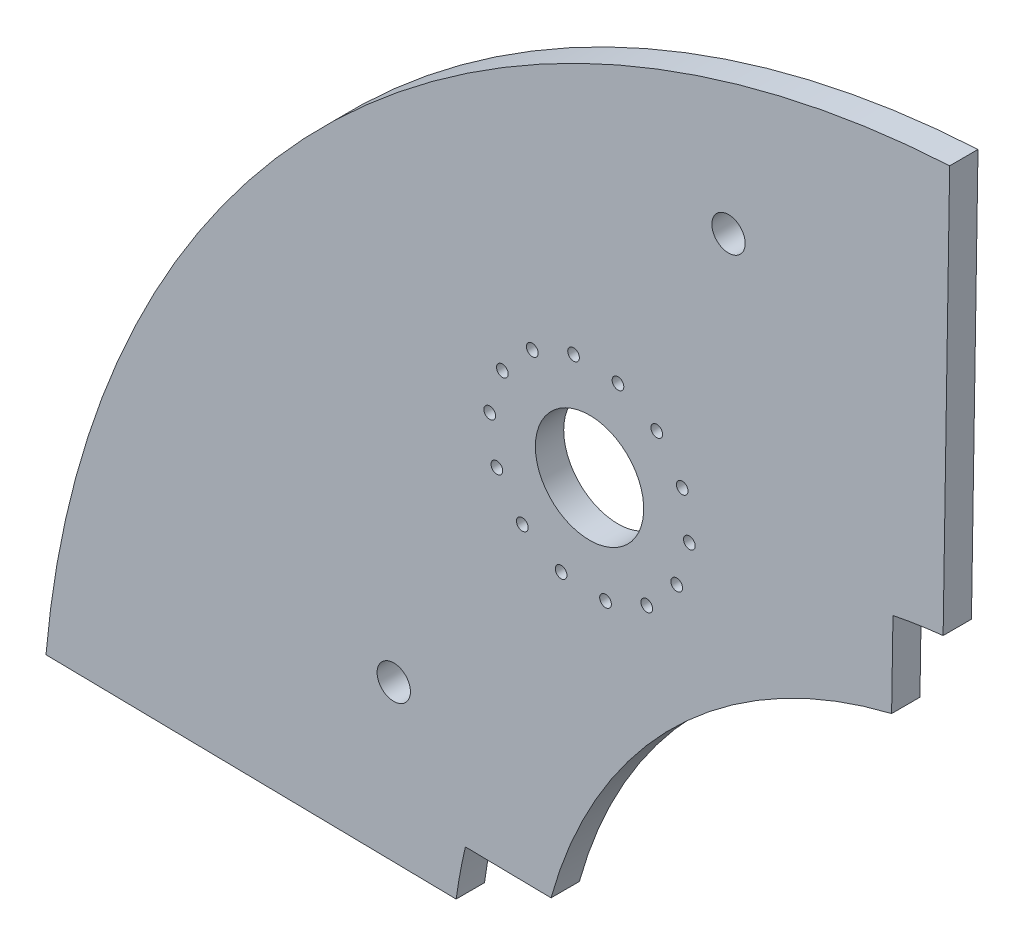
ISO-10303-21;
HEADER;
FILE_DESCRIPTION(('STEP AP214'),'2;1');
FILE_NAME('part.step','',(''),(''),'','','');
FILE_SCHEMA(('AUTOMOTIVE_DESIGN { 1 0 10303 214 1 1 1 1 }'));
ENDSEC;
DATA;
#1=APPLICATION_CONTEXT('core data for automotive mechanical design processes');
#2=APPLICATION_PROTOCOL_DEFINITION('international standard','automotive_design',2000,#1);
#3=PRODUCT_CONTEXT('',#1,'mechanical');
#4=PRODUCT('Part','Part','',(#3));
#5=PRODUCT_RELATED_PRODUCT_CATEGORY('part','',(#4));
#6=PRODUCT_DEFINITION_FORMATION('','',#4);
#7=PRODUCT_DEFINITION_CONTEXT('part definition',#1,'design');
#8=PRODUCT_DEFINITION('design','',#6,#7);
#9=PRODUCT_DEFINITION_SHAPE('','',#8);
#10=(LENGTH_UNIT() NAMED_UNIT(*) SI_UNIT(.MILLI.,.METRE.));
#11=(NAMED_UNIT(*) PLANE_ANGLE_UNIT() SI_UNIT($,.RADIAN.));
#12=(NAMED_UNIT(*) SI_UNIT($,.STERADIAN.) SOLID_ANGLE_UNIT());
#13=UNCERTAINTY_MEASURE_WITH_UNIT(LENGTH_MEASURE(1.E-05),#10,'distance_accuracy_value','');
#14=(GEOMETRIC_REPRESENTATION_CONTEXT(3) GLOBAL_UNCERTAINTY_ASSIGNED_CONTEXT((#13)) GLOBAL_UNIT_ASSIGNED_CONTEXT((#10,
#11,#12)) REPRESENTATION_CONTEXT('',''));
#15=CARTESIAN_POINT('',(0.,0.,0.));
#16=DIRECTION('',(0.,0.,1.));
#17=DIRECTION('',(1.,0.,0.));
#18=AXIS2_PLACEMENT_3D('',#15,#16,#17);
#19=CARTESIAN_POINT('',(4.07862578885082,4.75361348173175,1.7));
#20=DIRECTION('',(0.,0.,1.));
#21=DIRECTION('',(1.,0.,0.));
#22=AXIS2_PLACEMENT_3D('',#19,#20,#21);
#23=PLANE('',#22);
#24=CARTESIAN_POINT('',(-12.2707574441854,52.0050438082216,1.7));
#25=DIRECTION('',(0.,0.,1.));
#26=DIRECTION('',(1.,0.,0.));
#27=AXIS2_PLACEMENT_3D('',#24,#25,#26);
#28=CIRCLE('',#27,0.999999999997956);
#29=CARTESIAN_POINT('',(-11.2707574441874,52.0050438082216,1.7));
#30=VERTEX_POINT('',#29);
#31=EDGE_CURVE('E162',#30,#30,#28,.T.);
#32=ORIENTED_EDGE('',*,*,#31,.F.);
#33=EDGE_LOOP('',(#32));
#34=FACE_BOUND('',#33,.T.);
#35=CARTESIAN_POINT('',(-21.5660954258525,41.0912692689008,1.7));
#36=DIRECTION('',(0.,0.,1.));
#37=DIRECTION('',(-1.,0.,0.));
#38=AXIS2_PLACEMENT_3D('',#35,#36,#37);
#39=CIRCLE('',#38,0.349999999999997);
#40=CARTESIAN_POINT('',(-21.9160954258525,41.0912692689008,1.7));
#41=VERTEX_POINT('',#40);
#42=EDGE_CURVE('E179',#41,#41,#39,.T.);
#43=ORIENTED_EDGE('',*,*,#42,.F.);
#44=EDGE_LOOP('',(#43));
#45=FACE_BOUND('',#44,.T.);
#46=CARTESIAN_POINT('',(-25.8357190055157,38.1114959966274,1.7));
#47=DIRECTION('',(0.,0.,1.));
#48=DIRECTION('',(-1.,0.,0.));
#49=AXIS2_PLACEMENT_3D('',#46,#47,#48);
#50=CIRCLE('',#49,0.350000000000012);
#51=CARTESIAN_POINT('',(-26.1857190055158,38.1114959966274,1.7));
#52=VERTEX_POINT('',#51);
#53=EDGE_CURVE('E191',#52,#52,#50,.T.);
#54=ORIENTED_EDGE('',*,*,#53,.F.);
#55=EDGE_LOOP('',(#54));
#56=FACE_BOUND('',#55,.T.);
#57=CARTESIAN_POINT('',(-26.1681052103312,32.9155116166451,1.7));
#58=DIRECTION('',(0.,0.,1.));
#59=DIRECTION('',(-1.,0.,0.));
#60=AXIS2_PLACEMENT_3D('',#57,#58,#59);
#61=CIRCLE('',#60,0.350000000000009);
#62=CARTESIAN_POINT('',(-26.5181052103312,32.9155116166451,1.7));
#63=VERTEX_POINT('',#62);
#64=EDGE_CURVE('E203',#63,#63,#61,.T.);
#65=ORIENTED_EDGE('',*,*,#64,.F.);
#66=EDGE_LOOP('',(#65));
#67=FACE_BOUND('',#66,.T.);
#68=CARTESIAN_POINT('',(-22.31296044863,29.4159983458462,1.7));
#69=DIRECTION('',(0.,0.,1.));
#70=DIRECTION('',(-1.,0.,0.));
#71=AXIS2_PLACEMENT_3D('',#68,#69,#70);
#72=CIRCLE('',#71,0.350000000000001);
#73=CARTESIAN_POINT('',(-22.66296044863,29.4159983458462,1.7));
#74=VERTEX_POINT('',#73);
#75=EDGE_CURVE('E215',#74,#74,#72,.T.);
#76=ORIENTED_EDGE('',*,*,#75,.F.);
#77=EDGE_LOOP('',(#76));
#78=FACE_BOUND('',#77,.T.);
#79=CARTESIAN_POINT('',(-17.1732873565947,30.2481610542034,1.7));
#80=DIRECTION('',(0.,0.,1.));
#81=DIRECTION('',(-1.,0.,0.));
#82=AXIS2_PLACEMENT_3D('',#79,#80,#81);
#83=CIRCLE('',#82,0.350000000000006);
#84=CARTESIAN_POINT('',(-17.5232873565948,30.2481610542034,1.7));
#85=VERTEX_POINT('',#84);
#86=EDGE_CURVE('E227',#85,#85,#83,.T.);
#87=ORIENTED_EDGE('',*,*,#86,.F.);
#88=EDGE_LOOP('',(#87));
#89=FACE_BOUND('',#88,.T.);
#90=CARTESIAN_POINT('',(-14.6193646027526,34.7853642492983,1.7));
#91=DIRECTION('',(0.,0.,1.));
#92=DIRECTION('',(-1.,0.,0.));
#93=AXIS2_PLACEMENT_3D('',#90,#91,#92);
#94=CIRCLE('',#93,0.350000000000003);
#95=CARTESIAN_POINT('',(-14.9693646027526,34.7853642492983,1.7));
#96=VERTEX_POINT('',#95);
#97=EDGE_CURVE('E239',#96,#96,#94,.T.);
#98=ORIENTED_EDGE('',*,*,#97,.F.);
#99=EDGE_LOOP('',(#98));
#100=FACE_BOUND('',#99,.T.);
#101=CARTESIAN_POINT('',(-16.5743481112768,39.611001383146,1.7));
#102=DIRECTION('',(0.,0.,1.));
#103=DIRECTION('',(-1.,0.,0.));
#104=AXIS2_PLACEMENT_3D('',#101,#102,#103);
#105=CIRCLE('',#104,0.35);
#106=CARTESIAN_POINT('',(-16.9243481112768,39.611001383146,1.7));
#107=VERTEX_POINT('',#106);
#108=EDGE_CURVE('E251',#107,#107,#105,.T.);
#109=ORIENTED_EDGE('',*,*,#108,.F.);
#110=EDGE_LOOP('',(#109));
#111=FACE_BOUND('',#110,.T.);
#112=DIRECTION('',(0.0159509238825174,0.999872775920664,0.));
#113=VECTOR('',#112,1.);
#114=CARTESIAN_POINT('',(-2.47843867311703,32.5745571329017,1.7));
#115=LINE('',#114,#113);
#116=CARTESIAN_POINT('',(-2.48804000471668,31.9727042151781,1.7));
#117=VERTEX_POINT('',#116);
#118=CARTESIAN_POINT('',(-2.40608180393485,37.1101980888262,1.7));
#119=VERTEX_POINT('',#118);
#120=EDGE_CURVE('E95',#117,#119,#115,.T.);
#121=ORIENTED_EDGE('',*,*,#120,.T.);
#122=CARTESIAN_POINT('',(4.07862578885082,4.75361348173175,1.7));
#123=DIRECTION('',(0.,0.,-1.));
#124=DIRECTION('',(1.,0.,0.));
#125=AXIS2_PLACEMENT_3D('',#122,#123,#124);
#126=CIRCLE('',#125,32.9999999999999);
#127=CARTESIAN_POINT('',(0.601633973890489,37.5699284472896,1.7));
#128=VERTEX_POINT('',#127);
#129=EDGE_CURVE('E262',#119,#128,#126,.T.);
#130=ORIENTED_EDGE('',*,*,#129,.T.);
#131=DIRECTION('',(0.0159509238824463,0.999872775920665,0.));
#132=VECTOR('',#131,1.);
#133=CARTESIAN_POINT('',(0.994090857995947,62.170820347447,1.7));
#134=LINE('',#133,#132);
#135=CARTESIAN_POINT('',(0.994090857995947,62.170820347447,1.7));
#136=VERTEX_POINT('',#135);
#137=EDGE_CURVE('E264',#128,#136,#134,.T.);
#138=ORIENTED_EDGE('',*,*,#137,.T.);
#139=CARTESIAN_POINT('',(4.07862578885082,4.75361348173175,1.7));
#140=DIRECTION('',(0.,0.,1.));
#141=DIRECTION('',(1.,0.,0.));
#142=AXIS2_PLACEMENT_3D('',#139,#140,#141);
#143=CIRCLE('',#142,57.5);
#144=CARTESIAN_POINT('',(-53.2109736858043,9.6680607582421,1.7));
#145=VERTEX_POINT('',#144);
#146=EDGE_CURVE('E266',#136,#145,#143,.T.);
#147=ORIENTED_EDGE('',*,*,#146,.T.);
#148=DIRECTION('',(0.999872775920664,-0.0159509238825176,0.));
#149=VECTOR('',#148,1.);
#150=CARTESIAN_POINT('',(-53.2109736858043,9.6680607582421,1.7));
#151=LINE('',#150,#149);
#152=CARTESIAN_POINT('',(-28.6100817856467,9.27560387413488,1.7));
#153=VERTEX_POINT('',#152);
#154=EDGE_CURVE('E115',#145,#153,#151,.T.);
#155=ORIENTED_EDGE('',*,*,#154,.T.);
#156=CARTESIAN_POINT('',(4.07862578885082,4.75361348173175,1.7));
#157=DIRECTION('',(0.,0.,-1.));
#158=DIRECTION('',(1.,0.,0.));
#159=AXIS2_PLACEMENT_3D('',#156,#157,#158);
#160=CIRCLE('',#159,32.9999999999999);
#161=CARTESIAN_POINT('',(-28.0546458838881,12.2671247518338,1.7));
#162=VERTEX_POINT('',#161);
#163=EDGE_CURVE('E109',#153,#162,#160,.T.);
#164=ORIENTED_EDGE('',*,*,#163,.T.);
#165=DIRECTION('',(0.999872775920664,-0.0159509238825179,0.));
#166=VECTOR('',#165,1.);
#167=CARTESIAN_POINT('',(-23.5190049279638,12.1947678826513,1.7));
#168=LINE('',#167,#166);
#169=CARTESIAN_POINT('',(-22.9171520102399,12.1851665510517,1.7));
#170=VERTEX_POINT('',#169);
#171=EDGE_CURVE('E113',#162,#170,#168,.T.);
#172=ORIENTED_EDGE('',*,*,#171,.T.);
#173=CARTESIAN_POINT('',(4.07862578885082,4.75361348173175,1.7));
#174=DIRECTION('',(0.,0.,-1.));
#175=DIRECTION('',(1.,0.,0.));
#176=AXIS2_PLACEMENT_3D('',#173,#174,#175);
#177=CIRCLE('',#176,27.9999999999999);
#178=EDGE_CURVE('E54',#170,#117,#177,.T.);
#179=ORIENTED_EDGE('',*,*,#178,.T.);
#180=EDGE_LOOP('',(#121,#130,#138,#147,#155,#164,#172,#179));
#181=FACE_BOUND('',#180,.T.);
#182=CARTESIAN_POINT('',(-18.9012910259282,40.9208022012017,1.7));
#183=DIRECTION('',(0.,0.,1.));
#184=DIRECTION('',(-1.,0.,0.));
#185=AXIS2_PLACEMENT_3D('',#182,#183,#184);
#186=CIRCLE('',#185,0.349999999999994);
#187=CARTESIAN_POINT('',(-19.2512910259282,40.9208022012017,1.7));
#188=VERTEX_POINT('',#187);
#189=EDGE_CURVE('E136',#188,#188,#186,.T.);
#190=ORIENTED_EDGE('',*,*,#189,.F.);
#191=EDGE_LOOP('',(#190));
#192=FACE_BOUND('',#191,.T.);
#193=CARTESIAN_POINT('',(-15.046146264227,37.4212889304027,1.7));
#194=DIRECTION('',(0.,0.,1.));
#195=DIRECTION('',(-1.,0.,0.));
#196=AXIS2_PLACEMENT_3D('',#193,#194,#195);
#197=CIRCLE('',#196,0.35);
#198=CARTESIAN_POINT('',(-15.396146264227,37.4212889304027,1.7));
#199=VERTEX_POINT('',#198);
#200=EDGE_CURVE('E245',#199,#199,#197,.T.);
#201=ORIENTED_EDGE('',*,*,#200,.F.);
#202=EDGE_LOOP('',(#201));
#203=FACE_BOUND('',#202,.T.);
#204=CARTESIAN_POINT('',(-15.3785324690424,32.2253045504204,1.7));
#205=DIRECTION('',(0.,0.,1.));
#206=DIRECTION('',(-1.,0.,0.));
#207=AXIS2_PLACEMENT_3D('',#204,#205,#206);
#208=CIRCLE('',#207,0.35);
#209=CARTESIAN_POINT('',(-15.7285324690424,32.2253045504204,1.7));
#210=VERTEX_POINT('',#209);
#211=EDGE_CURVE('E233',#210,#210,#208,.T.);
#212=ORIENTED_EDGE('',*,*,#211,.F.);
#213=EDGE_LOOP('',(#212));
#214=FACE_BOUND('',#213,.T.);
#215=CARTESIAN_POINT('',(-19.6481560487057,29.245531278147,1.7));
#216=DIRECTION('',(0.,0.,1.));
#217=DIRECTION('',(-1.,0.,0.));
#218=AXIS2_PLACEMENT_3D('',#215,#216,#217);
#219=CIRCLE('',#218,0.349999999999998);
#220=CARTESIAN_POINT('',(-19.9981560487057,29.245531278147,1.7));
#221=VERTEX_POINT('',#220);
#222=EDGE_CURVE('E221',#221,#221,#219,.T.);
#223=ORIENTED_EDGE('',*,*,#222,.F.);
#224=EDGE_LOOP('',(#223));
#225=FACE_BOUND('',#224,.T.);
#226=CARTESIAN_POINT('',(-24.6399033632814,30.7257991639019,1.7));
#227=DIRECTION('',(0.,0.,1.));
#228=DIRECTION('',(-1.,0.,0.));
#229=AXIS2_PLACEMENT_3D('',#226,#227,#228);
#230=CIRCLE('',#229,0.349999999999998);
#231=CARTESIAN_POINT('',(-24.9899033632814,30.7257991639019,1.7));
#232=VERTEX_POINT('',#231);
#233=EDGE_CURVE('E209',#232,#232,#230,.T.);
#234=ORIENTED_EDGE('',*,*,#233,.F.);
#235=EDGE_LOOP('',(#234));
#236=FACE_BOUND('',#235,.T.);
#237=CARTESIAN_POINT('',(-26.5948868718055,35.5514362977495,1.7));
#238=DIRECTION('',(0.,0.,1.));
#239=DIRECTION('',(-1.,0.,0.));
#240=AXIS2_PLACEMENT_3D('',#237,#238,#239);
#241=CIRCLE('',#240,0.349999999999989);
#242=CARTESIAN_POINT('',(-26.9448868718055,35.5514362977495,1.7));
#243=VERTEX_POINT('',#242);
#244=EDGE_CURVE('E197',#243,#243,#241,.T.);
#245=ORIENTED_EDGE('',*,*,#244,.F.);
#246=EDGE_LOOP('',(#245));
#247=FACE_BOUND('',#246,.T.);
#248=CARTESIAN_POINT('',(-24.0409641179634,40.0886394928444,1.7));
#249=DIRECTION('',(0.,0.,1.));
#250=DIRECTION('',(-1.,0.,0.));
#251=AXIS2_PLACEMENT_3D('',#248,#249,#250);
#252=CIRCLE('',#251,0.349999999999999);
#253=CARTESIAN_POINT('',(-24.3909641179634,40.0886394928444,1.7));
#254=VERTEX_POINT('',#253);
#255=EDGE_CURVE('E185',#254,#254,#252,.T.);
#256=ORIENTED_EDGE('',*,*,#255,.F.);
#257=EDGE_LOOP('',(#256));
#258=FACE_BOUND('',#257,.T.);
#259=CARTESIAN_POINT('',(-20.6071257372791,35.168400273524,1.7));
#260=DIRECTION('',(0.,0.,1.));
#261=DIRECTION('',(-1.,0.,0.));
#262=AXIS2_PLACEMENT_3D('',#259,#260,#261);
#263=CIRCLE('',#262,3.24999999999998);
#264=CARTESIAN_POINT('',(-23.857125737279,35.168400273524,1.7));
#265=VERTEX_POINT('',#264);
#266=EDGE_CURVE('E166',#265,#265,#263,.T.);
#267=ORIENTED_EDGE('',*,*,#266,.F.);
#268=EDGE_LOOP('',(#267));
#269=FACE_BOUND('',#268,.T.);
#270=CARTESIAN_POINT('',(-32.3519579585651,18.6752717099223,1.7));
#271=DIRECTION('',(0.,0.,1.));
#272=DIRECTION('',(1.,0.,0.));
#273=AXIS2_PLACEMENT_3D('',#270,#271,#272);
#274=CIRCLE('',#273,1.00000000000623);
#275=CARTESIAN_POINT('',(-31.3519579585589,18.6752717099223,1.7));
#276=VERTEX_POINT('',#275);
#277=EDGE_CURVE('E173',#276,#276,#274,.T.);
#278=ORIENTED_EDGE('',*,*,#277,.F.);
#279=EDGE_LOOP('',(#278));
#280=FACE_BOUND('',#279,.T.);
#281=ADVANCED_FACE('F35',(#34,#45,#56,#67,#78,#89,#100,#111,#181,#192,#203,#214,#225,#236,#247,
#258,#269,#280),#23,.T.);
#282=CARTESIAN_POINT('',(4.07862578885082,4.75361348173175,0.));
#283=DIRECTION('',(0.,0.,1.));
#284=DIRECTION('',(1.,0.,0.));
#285=AXIS2_PLACEMENT_3D('',#282,#283,#284);
#286=PLANE('',#285);
#287=CARTESIAN_POINT('',(-12.2707574441854,52.0050438082216,0.));
#288=DIRECTION('',(0.,0.,1.));
#289=DIRECTION('',(1.,0.,0.));
#290=AXIS2_PLACEMENT_3D('',#287,#288,#289);
#291=CIRCLE('',#290,0.999999999997956);
#292=CARTESIAN_POINT('',(-11.2707574441874,52.0050438082216,0.));
#293=VERTEX_POINT('',#292);
#294=EDGE_CURVE('E159',#293,#293,#291,.F.);
#295=ORIENTED_EDGE('',*,*,#294,.F.);
#296=EDGE_LOOP('',(#295));
#297=FACE_BOUND('',#296,.T.);
#298=CARTESIAN_POINT('',(-21.5660954258525,41.0912692689008,0.));
#299=DIRECTION('',(0.,0.,1.));
#300=DIRECTION('',(-1.,0.,0.));
#301=AXIS2_PLACEMENT_3D('',#298,#299,#300);
#302=CIRCLE('',#301,0.349999999999997);
#303=CARTESIAN_POINT('',(-21.9160954258525,41.0912692689008,0.));
#304=VERTEX_POINT('',#303);
#305=EDGE_CURVE('E177',#304,#304,#302,.T.);
#306=ORIENTED_EDGE('',*,*,#305,.T.);
#307=EDGE_LOOP('',(#306));
#308=FACE_BOUND('',#307,.T.);
#309=CARTESIAN_POINT('',(-25.8357190055157,38.1114959966274,0.));
#310=DIRECTION('',(0.,0.,1.));
#311=DIRECTION('',(-1.,0.,0.));
#312=AXIS2_PLACEMENT_3D('',#309,#310,#311);
#313=CIRCLE('',#312,0.350000000000012);
#314=CARTESIAN_POINT('',(-26.1857190055158,38.1114959966274,0.));
#315=VERTEX_POINT('',#314);
#316=EDGE_CURVE('E188',#315,#315,#313,.T.);
#317=ORIENTED_EDGE('',*,*,#316,.T.);
#318=EDGE_LOOP('',(#317));
#319=FACE_BOUND('',#318,.T.);
#320=CARTESIAN_POINT('',(-26.1681052103312,32.9155116166451,0.));
#321=DIRECTION('',(0.,0.,1.));
#322=DIRECTION('',(-1.,0.,0.));
#323=AXIS2_PLACEMENT_3D('',#320,#321,#322);
#324=CIRCLE('',#323,0.350000000000009);
#325=CARTESIAN_POINT('',(-26.5181052103312,32.9155116166451,0.));
#326=VERTEX_POINT('',#325);
#327=EDGE_CURVE('E200',#326,#326,#324,.T.);
#328=ORIENTED_EDGE('',*,*,#327,.T.);
#329=EDGE_LOOP('',(#328));
#330=FACE_BOUND('',#329,.T.);
#331=CARTESIAN_POINT('',(-22.31296044863,29.4159983458462,0.));
#332=DIRECTION('',(0.,0.,1.));
#333=DIRECTION('',(-1.,0.,0.));
#334=AXIS2_PLACEMENT_3D('',#331,#332,#333);
#335=CIRCLE('',#334,0.350000000000001);
#336=CARTESIAN_POINT('',(-22.66296044863,29.4159983458462,0.));
#337=VERTEX_POINT('',#336);
#338=EDGE_CURVE('E212',#337,#337,#335,.T.);
#339=ORIENTED_EDGE('',*,*,#338,.T.);
#340=EDGE_LOOP('',(#339));
#341=FACE_BOUND('',#340,.T.);
#342=CARTESIAN_POINT('',(-17.1732873565947,30.2481610542034,0.));
#343=DIRECTION('',(0.,0.,1.));
#344=DIRECTION('',(-1.,0.,0.));
#345=AXIS2_PLACEMENT_3D('',#342,#343,#344);
#346=CIRCLE('',#345,0.350000000000006);
#347=CARTESIAN_POINT('',(-17.5232873565948,30.2481610542034,0.));
#348=VERTEX_POINT('',#347);
#349=EDGE_CURVE('E224',#348,#348,#346,.T.);
#350=ORIENTED_EDGE('',*,*,#349,.T.);
#351=EDGE_LOOP('',(#350));
#352=FACE_BOUND('',#351,.T.);
#353=CARTESIAN_POINT('',(-14.6193646027526,34.7853642492983,0.));
#354=DIRECTION('',(0.,0.,1.));
#355=DIRECTION('',(-1.,0.,0.));
#356=AXIS2_PLACEMENT_3D('',#353,#354,#355);
#357=CIRCLE('',#356,0.350000000000003);
#358=CARTESIAN_POINT('',(-14.9693646027526,34.7853642492983,0.));
#359=VERTEX_POINT('',#358);
#360=EDGE_CURVE('E236',#359,#359,#357,.T.);
#361=ORIENTED_EDGE('',*,*,#360,.T.);
#362=EDGE_LOOP('',(#361));
#363=FACE_BOUND('',#362,.T.);
#364=CARTESIAN_POINT('',(-16.5743481112768,39.611001383146,0.));
#365=DIRECTION('',(0.,0.,1.));
#366=DIRECTION('',(-1.,0.,0.));
#367=AXIS2_PLACEMENT_3D('',#364,#365,#366);
#368=CIRCLE('',#367,0.35);
#369=CARTESIAN_POINT('',(-16.9243481112768,39.611001383146,0.));
#370=VERTEX_POINT('',#369);
#371=EDGE_CURVE('E248',#370,#370,#368,.T.);
#372=ORIENTED_EDGE('',*,*,#371,.T.);
#373=EDGE_LOOP('',(#372));
#374=FACE_BOUND('',#373,.T.);
#375=DIRECTION('',(0.0159509238824584,0.999872775920665,0.));
#376=VECTOR('',#375,1.);
#377=CARTESIAN_POINT('',(-2.40608180393485,37.1101980888262,0.));
#378=LINE('',#377,#376);
#379=CARTESIAN_POINT('',(-2.48804000471668,31.9727042151781,0.));
#380=VERTEX_POINT('',#379);
#381=CARTESIAN_POINT('',(-2.40608180393485,37.1101980888262,0.));
#382=VERTEX_POINT('',#381);
#383=EDGE_CURVE('E89',#380,#382,#378,.T.);
#384=ORIENTED_EDGE('',*,*,#383,.F.);
#385=CARTESIAN_POINT('',(4.07862578885082,4.75361348173175,0.));
#386=DIRECTION('',(0.,0.,-1.));
#387=DIRECTION('',(1.,0.,0.));
#388=AXIS2_PLACEMENT_3D('',#385,#386,#387);
#389=CIRCLE('',#388,27.9999999999999);
#390=CARTESIAN_POINT('',(-22.9171520102399,12.1851665510517,0.));
#391=VERTEX_POINT('',#390);
#392=EDGE_CURVE('E146',#391,#380,#389,.T.);
#393=ORIENTED_EDGE('',*,*,#392,.F.);
#394=DIRECTION('',(0.999872775920664,-0.0159509238825172,0.));
#395=VECTOR('',#394,1.);
#396=CARTESIAN_POINT('',(-23.5190049279638,12.1947678826513,0.));
#397=LINE('',#396,#395);
#398=CARTESIAN_POINT('',(-28.0546458838881,12.2671247518338,0.));
#399=VERTEX_POINT('',#398);
#400=EDGE_CURVE('E82',#399,#391,#397,.T.);
#401=ORIENTED_EDGE('',*,*,#400,.F.);
#402=CARTESIAN_POINT('',(4.07862578885082,4.75361348173175,0.));
#403=DIRECTION('',(0.,0.,-1.));
#404=DIRECTION('',(1.,0.,0.));
#405=AXIS2_PLACEMENT_3D('',#402,#403,#404);
#406=CIRCLE('',#405,32.9999999999999);
#407=CARTESIAN_POINT('',(-28.6100817856467,9.27560387413488,0.));
#408=VERTEX_POINT('',#407);
#409=EDGE_CURVE('E124',#408,#399,#406,.T.);
#410=ORIENTED_EDGE('',*,*,#409,.F.);
#411=DIRECTION('',(0.999872775920664,-0.0159509238825176,0.));
#412=VECTOR('',#411,1.);
#413=CARTESIAN_POINT('',(-53.2109736858043,9.6680607582421,0.));
#414=LINE('',#413,#412);
#415=CARTESIAN_POINT('',(-53.2109736858043,9.6680607582421,0.));
#416=VERTEX_POINT('',#415);
#417=EDGE_CURVE('E142',#416,#408,#414,.T.);
#418=ORIENTED_EDGE('',*,*,#417,.F.);
#419=CARTESIAN_POINT('',(4.07862578885082,4.75361348173175,0.));
#420=DIRECTION('',(0.,0.,1.));
#421=DIRECTION('',(1.,0.,0.));
#422=AXIS2_PLACEMENT_3D('',#419,#420,#421);
#423=CIRCLE('',#422,57.5);
#424=CARTESIAN_POINT('',(0.994090857995947,62.170820347447,0.));
#425=VERTEX_POINT('',#424);
#426=EDGE_CURVE('E140',#425,#416,#423,.T.);
#427=ORIENTED_EDGE('',*,*,#426,.F.);
#428=DIRECTION('',(0.0159509238824463,0.999872775920665,0.));
#429=VECTOR('',#428,1.);
#430=CARTESIAN_POINT('',(0.994090857995947,62.170820347447,0.));
#431=LINE('',#430,#429);
#432=CARTESIAN_POINT('',(0.601633973890489,37.5699284472896,0.));
#433=VERTEX_POINT('',#432);
#434=EDGE_CURVE('E138',#433,#425,#431,.T.);
#435=ORIENTED_EDGE('',*,*,#434,.F.);
#436=CARTESIAN_POINT('',(4.07862578885082,4.75361348173175,0.));
#437=DIRECTION('',(0.,0.,-1.));
#438=DIRECTION('',(1.,0.,0.));
#439=AXIS2_PLACEMENT_3D('',#436,#437,#438);
#440=CIRCLE('',#439,32.9999999999999);
#441=EDGE_CURVE('E135',#382,#433,#440,.T.);
#442=ORIENTED_EDGE('',*,*,#441,.F.);
#443=EDGE_LOOP('',(#384,#393,#401,#410,#418,#427,#435,#442));
#444=FACE_BOUND('',#443,.T.);
#445=CARTESIAN_POINT('',(-18.9012910259282,40.9208022012017,0.));
#446=DIRECTION('',(0.,0.,1.));
#447=DIRECTION('',(-1.,0.,0.));
#448=AXIS2_PLACEMENT_3D('',#445,#446,#447);
#449=CIRCLE('',#448,0.349999999999994);
#450=CARTESIAN_POINT('',(-19.2512910259282,40.9208022012017,0.));
#451=VERTEX_POINT('',#450);
#452=EDGE_CURVE('E254',#451,#451,#449,.T.);
#453=ORIENTED_EDGE('',*,*,#452,.T.);
#454=EDGE_LOOP('',(#453));
#455=FACE_BOUND('',#454,.T.);
#456=CARTESIAN_POINT('',(-15.046146264227,37.4212889304027,0.));
#457=DIRECTION('',(0.,0.,1.));
#458=DIRECTION('',(-1.,0.,0.));
#459=AXIS2_PLACEMENT_3D('',#456,#457,#458);
#460=CIRCLE('',#459,0.35);
#461=CARTESIAN_POINT('',(-15.396146264227,37.4212889304027,0.));
#462=VERTEX_POINT('',#461);
#463=EDGE_CURVE('E242',#462,#462,#460,.T.);
#464=ORIENTED_EDGE('',*,*,#463,.T.);
#465=EDGE_LOOP('',(#464));
#466=FACE_BOUND('',#465,.T.);
#467=CARTESIAN_POINT('',(-15.3785324690424,32.2253045504204,0.));
#468=DIRECTION('',(0.,0.,1.));
#469=DIRECTION('',(-1.,0.,0.));
#470=AXIS2_PLACEMENT_3D('',#467,#468,#469);
#471=CIRCLE('',#470,0.35);
#472=CARTESIAN_POINT('',(-15.7285324690424,32.2253045504204,0.));
#473=VERTEX_POINT('',#472);
#474=EDGE_CURVE('E230',#473,#473,#471,.T.);
#475=ORIENTED_EDGE('',*,*,#474,.T.);
#476=EDGE_LOOP('',(#475));
#477=FACE_BOUND('',#476,.T.);
#478=CARTESIAN_POINT('',(-19.6481560487057,29.245531278147,0.));
#479=DIRECTION('',(0.,0.,1.));
#480=DIRECTION('',(-1.,0.,0.));
#481=AXIS2_PLACEMENT_3D('',#478,#479,#480);
#482=CIRCLE('',#481,0.349999999999998);
#483=CARTESIAN_POINT('',(-19.9981560487057,29.245531278147,0.));
#484=VERTEX_POINT('',#483);
#485=EDGE_CURVE('E218',#484,#484,#482,.T.);
#486=ORIENTED_EDGE('',*,*,#485,.T.);
#487=EDGE_LOOP('',(#486));
#488=FACE_BOUND('',#487,.T.);
#489=CARTESIAN_POINT('',(-24.6399033632814,30.7257991639019,0.));
#490=DIRECTION('',(0.,0.,1.));
#491=DIRECTION('',(-1.,0.,0.));
#492=AXIS2_PLACEMENT_3D('',#489,#490,#491);
#493=CIRCLE('',#492,0.349999999999998);
#494=CARTESIAN_POINT('',(-24.9899033632814,30.7257991639019,0.));
#495=VERTEX_POINT('',#494);
#496=EDGE_CURVE('E206',#495,#495,#493,.T.);
#497=ORIENTED_EDGE('',*,*,#496,.T.);
#498=EDGE_LOOP('',(#497));
#499=FACE_BOUND('',#498,.T.);
#500=CARTESIAN_POINT('',(-26.5948868718055,35.5514362977495,0.));
#501=DIRECTION('',(0.,0.,1.));
#502=DIRECTION('',(-1.,0.,0.));
#503=AXIS2_PLACEMENT_3D('',#500,#501,#502);
#504=CIRCLE('',#503,0.349999999999989);
#505=CARTESIAN_POINT('',(-26.9448868718055,35.5514362977495,0.));
#506=VERTEX_POINT('',#505);
#507=EDGE_CURVE('E194',#506,#506,#504,.T.);
#508=ORIENTED_EDGE('',*,*,#507,.T.);
#509=EDGE_LOOP('',(#508));
#510=FACE_BOUND('',#509,.T.);
#511=CARTESIAN_POINT('',(-24.0409641179634,40.0886394928444,0.));
#512=DIRECTION('',(0.,0.,1.));
#513=DIRECTION('',(-1.,0.,0.));
#514=AXIS2_PLACEMENT_3D('',#511,#512,#513);
#515=CIRCLE('',#514,0.349999999999999);
#516=CARTESIAN_POINT('',(-24.3909641179634,40.0886394928444,0.));
#517=VERTEX_POINT('',#516);
#518=EDGE_CURVE('E182',#517,#517,#515,.T.);
#519=ORIENTED_EDGE('',*,*,#518,.T.);
#520=EDGE_LOOP('',(#519));
#521=FACE_BOUND('',#520,.T.);
#522=CARTESIAN_POINT('',(-20.6071257372791,35.168400273524,0.));
#523=DIRECTION('',(0.,0.,1.));
#524=DIRECTION('',(-1.,0.,0.));
#525=AXIS2_PLACEMENT_3D('',#522,#523,#524);
#526=CIRCLE('',#525,3.24999999999998);
#527=CARTESIAN_POINT('',(-23.857125737279,35.168400273524,0.));
#528=VERTEX_POINT('',#527);
#529=EDGE_CURVE('E161',#528,#528,#526,.T.);
#530=ORIENTED_EDGE('',*,*,#529,.T.);
#531=EDGE_LOOP('',(#530));
#532=FACE_BOUND('',#531,.T.);
#533=CARTESIAN_POINT('',(-32.3519579585651,18.6752717099223,0.));
#534=DIRECTION('',(0.,0.,1.));
#535=DIRECTION('',(1.,0.,0.));
#536=AXIS2_PLACEMENT_3D('',#533,#534,#535);
#537=CIRCLE('',#536,1.00000000000623);
#538=CARTESIAN_POINT('',(-31.3519579585589,18.6752717099223,0.));
#539=VERTEX_POINT('',#538);
#540=EDGE_CURVE('E39',#539,#539,#537,.F.);
#541=ORIENTED_EDGE('',*,*,#540,.F.);
#542=EDGE_LOOP('',(#541));
#543=FACE_BOUND('',#542,.T.);
#544=ADVANCED_FACE('F277',(#297,#308,#319,#330,#341,#352,#363,#374,#444,#455,#466,#477,#488,
#499,#510,#521,#532,#543),#286,.F.);
#545=CARTESIAN_POINT('',(-2.40608180393485,37.1101980888262,1.7));
#546=DIRECTION('',(-0.999872775920665,0.0159509238824584,0.));
#547=DIRECTION('',(-0.0159509238824584,-0.999872775920665,0.));
#548=AXIS2_PLACEMENT_3D('',#545,#546,#547);
#549=PLANE('',#548);
#550=ORIENTED_EDGE('',*,*,#383,.T.);
#551=DIRECTION('',(0.,0.,-1.));
#552=VECTOR('',#551,1.);
#553=CARTESIAN_POINT('',(-2.40608180393485,37.1101980888262,1.7));
#554=LINE('',#553,#552);
#555=EDGE_CURVE('E11',#119,#382,#554,.T.);
#556=ORIENTED_EDGE('',*,*,#555,.F.);
#557=ORIENTED_EDGE('',*,*,#120,.F.);
#558=DIRECTION('',(0.,0.,-1.));
#559=VECTOR('',#558,1.);
#560=CARTESIAN_POINT('',(-2.48804000471668,31.9727042151781,1.7));
#561=LINE('',#560,#559);
#562=EDGE_CURVE('E130',#117,#380,#561,.T.);
#563=ORIENTED_EDGE('',*,*,#562,.T.);
#564=EDGE_LOOP('',(#550,#556,#557,#563));
#565=FACE_BOUND('',#564,.T.);
#566=ADVANCED_FACE('F37',(#565),#549,.F.);
#567=CARTESIAN_POINT('',(4.07862578885082,4.75361348173175,1.7));
#568=DIRECTION('',(0.,0.,-1.));
#569=DIRECTION('',(-1.,0.,0.));
#570=AXIS2_PLACEMENT_3D('',#567,#568,#569);
#571=CYLINDRICAL_SURFACE('',#570,32.9999999999999);
#572=ORIENTED_EDGE('',*,*,#441,.T.);
#573=DIRECTION('',(0.,0.,-1.));
#574=VECTOR('',#573,1.);
#575=CARTESIAN_POINT('',(0.601633973890489,37.5699284472896,1.7));
#576=LINE('',#575,#574);
#577=EDGE_CURVE('E45',#128,#433,#576,.T.);
#578=ORIENTED_EDGE('',*,*,#577,.F.);
#579=ORIENTED_EDGE('',*,*,#129,.F.);
#580=ORIENTED_EDGE('',*,*,#555,.T.);
#581=EDGE_LOOP('',(#572,#578,#579,#580));
#582=FACE_BOUND('',#581,.T.);
#583=ADVANCED_FACE('F285',(#582),#571,.F.);
#584=CARTESIAN_POINT('',(0.994090857995947,62.170820347447,1.7));
#585=DIRECTION('',(-0.999872775920665,0.0159509238824463,0.));
#586=DIRECTION('',(-0.0159509238824463,-0.999872775920665,0.));
#587=AXIS2_PLACEMENT_3D('',#584,#585,#586);
#588=PLANE('',#587);
#589=ORIENTED_EDGE('',*,*,#434,.T.);
#590=DIRECTION('',(0.,0.,-1.));
#591=VECTOR('',#590,1.);
#592=CARTESIAN_POINT('',(0.994090857995947,62.170820347447,1.7));
#593=LINE('',#592,#591);
#594=EDGE_CURVE('E155',#136,#425,#593,.T.);
#595=ORIENTED_EDGE('',*,*,#594,.F.);
#596=ORIENTED_EDGE('',*,*,#137,.F.);
#597=ORIENTED_EDGE('',*,*,#577,.T.);
#598=EDGE_LOOP('',(#589,#595,#596,#597));
#599=FACE_BOUND('',#598,.T.);
#600=ADVANCED_FACE('F288',(#599),#588,.F.);
#601=CARTESIAN_POINT('',(4.07862578885082,4.75361348173175,1.7));
#602=DIRECTION('',(0.,0.,-1.));
#603=DIRECTION('',(-1.,0.,0.));
#604=AXIS2_PLACEMENT_3D('',#601,#602,#603);
#605=CYLINDRICAL_SURFACE('',#604,57.5);
#606=ORIENTED_EDGE('',*,*,#426,.T.);
#607=DIRECTION('',(0.,0.,-1.));
#608=VECTOR('',#607,1.);
#609=CARTESIAN_POINT('',(-53.2109736858043,9.6680607582421,1.7));
#610=LINE('',#609,#608);
#611=EDGE_CURVE('E152',#145,#416,#610,.T.);
#612=ORIENTED_EDGE('',*,*,#611,.F.);
#613=ORIENTED_EDGE('',*,*,#146,.F.);
#614=ORIENTED_EDGE('',*,*,#594,.T.);
#615=EDGE_LOOP('',(#606,#612,#613,#614));
#616=FACE_BOUND('',#615,.T.);
#617=ADVANCED_FACE('F272',(#616),#605,.T.);
#618=CARTESIAN_POINT('',(-53.2109736858043,9.6680607582421,1.7));
#619=DIRECTION('',(0.0159509238825176,0.999872775920664,0.));
#620=DIRECTION('',(-0.999872775920664,0.0159509238825176,0.));
#621=AXIS2_PLACEMENT_3D('',#618,#619,#620);
#622=PLANE('',#621);
#623=ORIENTED_EDGE('',*,*,#417,.T.);
#624=DIRECTION('',(0.,0.,-1.));
#625=VECTOR('',#624,1.);
#626=CARTESIAN_POINT('',(-28.6100817856467,9.27560387413488,1.7));
#627=LINE('',#626,#625);
#628=EDGE_CURVE('E125',#153,#408,#627,.T.);
#629=ORIENTED_EDGE('',*,*,#628,.F.);
#630=ORIENTED_EDGE('',*,*,#154,.F.);
#631=ORIENTED_EDGE('',*,*,#611,.T.);
#632=EDGE_LOOP('',(#623,#629,#630,#631));
#633=FACE_BOUND('',#632,.T.);
#634=ADVANCED_FACE('F276',(#633),#622,.F.);
#635=CARTESIAN_POINT('',(4.07862578885082,4.75361348173175,1.7));
#636=DIRECTION('',(0.,0.,-1.));
#637=DIRECTION('',(-1.,0.,0.));
#638=AXIS2_PLACEMENT_3D('',#635,#636,#637);
#639=CYLINDRICAL_SURFACE('',#638,32.9999999999999);
#640=ORIENTED_EDGE('',*,*,#409,.T.);
#641=DIRECTION('',(0.,0.,-1.));
#642=VECTOR('',#641,1.);
#643=CARTESIAN_POINT('',(-28.0546458838881,12.2671247518338,1.7));
#644=LINE('',#643,#642);
#645=EDGE_CURVE('E121',#162,#399,#644,.T.);
#646=ORIENTED_EDGE('',*,*,#645,.F.);
#647=ORIENTED_EDGE('',*,*,#163,.F.);
#648=ORIENTED_EDGE('',*,*,#628,.T.);
#649=EDGE_LOOP('',(#640,#646,#647,#648));
#650=FACE_BOUND('',#649,.T.);
#651=ADVANCED_FACE('F122',(#650),#639,.F.);
#652=CARTESIAN_POINT('',(-23.5190049279638,12.1947678826513,1.7));
#653=DIRECTION('',(0.0159509238825172,0.999872775920664,0.));
#654=DIRECTION('',(-0.999872775920664,0.0159509238825172,0.));
#655=AXIS2_PLACEMENT_3D('',#652,#653,#654);
#656=PLANE('',#655);
#657=ORIENTED_EDGE('',*,*,#400,.T.);
#658=DIRECTION('',(0.,0.,-1.));
#659=VECTOR('',#658,1.);
#660=CARTESIAN_POINT('',(-22.9171520102399,12.1851665510517,1.7));
#661=LINE('',#660,#659);
#662=EDGE_CURVE('E126',#170,#391,#661,.T.);
#663=ORIENTED_EDGE('',*,*,#662,.F.);
#664=ORIENTED_EDGE('',*,*,#171,.F.);
#665=ORIENTED_EDGE('',*,*,#645,.T.);
#666=EDGE_LOOP('',(#657,#663,#664,#665));
#667=FACE_BOUND('',#666,.T.);
#668=ADVANCED_FACE('F128',(#667),#656,.F.);
#669=CARTESIAN_POINT('',(4.07862578885082,4.75361348173175,1.7));
#670=DIRECTION('',(0.,0.,-1.));
#671=DIRECTION('',(-1.,0.,0.));
#672=AXIS2_PLACEMENT_3D('',#669,#670,#671);
#673=CYLINDRICAL_SURFACE('',#672,27.9999999999999);
#674=ORIENTED_EDGE('',*,*,#392,.T.);
#675=ORIENTED_EDGE('',*,*,#562,.F.);
#676=ORIENTED_EDGE('',*,*,#178,.F.);
#677=ORIENTED_EDGE('',*,*,#662,.T.);
#678=EDGE_LOOP('',(#674,#675,#676,#677));
#679=FACE_BOUND('',#678,.T.);
#680=ADVANCED_FACE('F280',(#679),#673,.F.);
#681=CARTESIAN_POINT('',(-18.9012910259282,40.9208022012017,1.7));
#682=DIRECTION('',(0.,0.,-1.));
#683=DIRECTION('',(-1.,0.,0.));
#684=AXIS2_PLACEMENT_3D('',#681,#682,#683);
#685=CYLINDRICAL_SURFACE('',#684,0.349999999999994);
#686=ORIENTED_EDGE('',*,*,#189,.T.);
#687=EDGE_LOOP('',(#686));
#688=FACE_BOUND('',#687,.T.);
#689=ORIENTED_EDGE('',*,*,#452,.F.);
#690=EDGE_LOOP('',(#689));
#691=FACE_BOUND('',#690,.T.);
#692=ADVANCED_FACE('F306',(#688,#691),#685,.F.);
#693=CARTESIAN_POINT('',(-16.5743481112768,39.611001383146,1.7));
#694=DIRECTION('',(0.,0.,-1.));
#695=DIRECTION('',(-1.,0.,0.));
#696=AXIS2_PLACEMENT_3D('',#693,#694,#695);
#697=CYLINDRICAL_SURFACE('',#696,0.35);
#698=ORIENTED_EDGE('',*,*,#108,.T.);
#699=EDGE_LOOP('',(#698));
#700=FACE_BOUND('',#699,.T.);
#701=ORIENTED_EDGE('',*,*,#371,.F.);
#702=EDGE_LOOP('',(#701));
#703=FACE_BOUND('',#702,.T.);
#704=ADVANCED_FACE('F338',(#700,#703),#697,.F.);
#705=CARTESIAN_POINT('',(-15.046146264227,37.4212889304027,1.7));
#706=DIRECTION('',(0.,0.,-1.));
#707=DIRECTION('',(-1.,0.,0.));
#708=AXIS2_PLACEMENT_3D('',#705,#706,#707);
#709=CYLINDRICAL_SURFACE('',#708,0.35);
#710=ORIENTED_EDGE('',*,*,#200,.T.);
#711=EDGE_LOOP('',(#710));
#712=FACE_BOUND('',#711,.T.);
#713=ORIENTED_EDGE('',*,*,#463,.F.);
#714=EDGE_LOOP('',(#713));
#715=FACE_BOUND('',#714,.T.);
#716=ADVANCED_FACE('F345',(#712,#715),#709,.F.);
#717=CARTESIAN_POINT('',(-14.6193646027526,34.7853642492983,1.7));
#718=DIRECTION('',(0.,0.,-1.));
#719=DIRECTION('',(-1.,0.,0.));
#720=AXIS2_PLACEMENT_3D('',#717,#718,#719);
#721=CYLINDRICAL_SURFACE('',#720,0.350000000000003);
#722=ORIENTED_EDGE('',*,*,#97,.T.);
#723=EDGE_LOOP('',(#722));
#724=FACE_BOUND('',#723,.T.);
#725=ORIENTED_EDGE('',*,*,#360,.F.);
#726=EDGE_LOOP('',(#725));
#727=FACE_BOUND('',#726,.T.);
#728=ADVANCED_FACE('F352',(#724,#727),#721,.F.);
#729=CARTESIAN_POINT('',(-15.3785324690424,32.2253045504204,1.7));
#730=DIRECTION('',(0.,0.,-1.));
#731=DIRECTION('',(-1.,0.,0.));
#732=AXIS2_PLACEMENT_3D('',#729,#730,#731);
#733=CYLINDRICAL_SURFACE('',#732,0.35);
#734=ORIENTED_EDGE('',*,*,#211,.T.);
#735=EDGE_LOOP('',(#734));
#736=FACE_BOUND('',#735,.T.);
#737=ORIENTED_EDGE('',*,*,#474,.F.);
#738=EDGE_LOOP('',(#737));
#739=FACE_BOUND('',#738,.T.);
#740=ADVANCED_FACE('F360',(#736,#739),#733,.F.);
#741=CARTESIAN_POINT('',(-17.1732873565947,30.2481610542034,1.7));
#742=DIRECTION('',(0.,0.,-1.));
#743=DIRECTION('',(-1.,0.,0.));
#744=AXIS2_PLACEMENT_3D('',#741,#742,#743);
#745=CYLINDRICAL_SURFACE('',#744,0.350000000000006);
#746=ORIENTED_EDGE('',*,*,#86,.T.);
#747=EDGE_LOOP('',(#746));
#748=FACE_BOUND('',#747,.T.);
#749=ORIENTED_EDGE('',*,*,#349,.F.);
#750=EDGE_LOOP('',(#749));
#751=FACE_BOUND('',#750,.T.);
#752=ADVANCED_FACE('F368',(#748,#751),#745,.F.);
#753=CARTESIAN_POINT('',(-19.6481560487057,29.245531278147,1.7));
#754=DIRECTION('',(0.,0.,-1.));
#755=DIRECTION('',(-1.,0.,0.));
#756=AXIS2_PLACEMENT_3D('',#753,#754,#755);
#757=CYLINDRICAL_SURFACE('',#756,0.349999999999998);
#758=ORIENTED_EDGE('',*,*,#222,.T.);
#759=EDGE_LOOP('',(#758));
#760=FACE_BOUND('',#759,.T.);
#761=ORIENTED_EDGE('',*,*,#485,.F.);
#762=EDGE_LOOP('',(#761));
#763=FACE_BOUND('',#762,.T.);
#764=ADVANCED_FACE('F376',(#760,#763),#757,.F.);
#765=CARTESIAN_POINT('',(-22.31296044863,29.4159983458462,1.7));
#766=DIRECTION('',(0.,0.,-1.));
#767=DIRECTION('',(-1.,0.,0.));
#768=AXIS2_PLACEMENT_3D('',#765,#766,#767);
#769=CYLINDRICAL_SURFACE('',#768,0.350000000000001);
#770=ORIENTED_EDGE('',*,*,#75,.T.);
#771=EDGE_LOOP('',(#770));
#772=FACE_BOUND('',#771,.T.);
#773=ORIENTED_EDGE('',*,*,#338,.F.);
#774=EDGE_LOOP('',(#773));
#775=FACE_BOUND('',#774,.T.);
#776=ADVANCED_FACE('F384',(#772,#775),#769,.F.);
#777=CARTESIAN_POINT('',(-24.6399033632814,30.7257991639019,1.7));
#778=DIRECTION('',(0.,0.,-1.));
#779=DIRECTION('',(-1.,0.,0.));
#780=AXIS2_PLACEMENT_3D('',#777,#778,#779);
#781=CYLINDRICAL_SURFACE('',#780,0.349999999999998);
#782=ORIENTED_EDGE('',*,*,#233,.T.);
#783=EDGE_LOOP('',(#782));
#784=FACE_BOUND('',#783,.T.);
#785=ORIENTED_EDGE('',*,*,#496,.F.);
#786=EDGE_LOOP('',(#785));
#787=FACE_BOUND('',#786,.T.);
#788=ADVANCED_FACE('F392',(#784,#787),#781,.F.);
#789=CARTESIAN_POINT('',(-26.1681052103312,32.9155116166451,1.7));
#790=DIRECTION('',(0.,0.,-1.));
#791=DIRECTION('',(-1.,0.,0.));
#792=AXIS2_PLACEMENT_3D('',#789,#790,#791);
#793=CYLINDRICAL_SURFACE('',#792,0.350000000000009);
#794=ORIENTED_EDGE('',*,*,#64,.T.);
#795=EDGE_LOOP('',(#794));
#796=FACE_BOUND('',#795,.T.);
#797=ORIENTED_EDGE('',*,*,#327,.F.);
#798=EDGE_LOOP('',(#797));
#799=FACE_BOUND('',#798,.T.);
#800=ADVANCED_FACE('F400',(#796,#799),#793,.F.);
#801=CARTESIAN_POINT('',(-26.5948868718055,35.5514362977495,1.7));
#802=DIRECTION('',(0.,0.,-1.));
#803=DIRECTION('',(-1.,0.,0.));
#804=AXIS2_PLACEMENT_3D('',#801,#802,#803);
#805=CYLINDRICAL_SURFACE('',#804,0.349999999999989);
#806=ORIENTED_EDGE('',*,*,#244,.T.);
#807=EDGE_LOOP('',(#806));
#808=FACE_BOUND('',#807,.T.);
#809=ORIENTED_EDGE('',*,*,#507,.F.);
#810=EDGE_LOOP('',(#809));
#811=FACE_BOUND('',#810,.T.);
#812=ADVANCED_FACE('F408',(#808,#811),#805,.F.);
#813=CARTESIAN_POINT('',(-25.8357190055157,38.1114959966274,1.7));
#814=DIRECTION('',(0.,0.,-1.));
#815=DIRECTION('',(-1.,0.,0.));
#816=AXIS2_PLACEMENT_3D('',#813,#814,#815);
#817=CYLINDRICAL_SURFACE('',#816,0.350000000000012);
#818=ORIENTED_EDGE('',*,*,#53,.T.);
#819=EDGE_LOOP('',(#818));
#820=FACE_BOUND('',#819,.T.);
#821=ORIENTED_EDGE('',*,*,#316,.F.);
#822=EDGE_LOOP('',(#821));
#823=FACE_BOUND('',#822,.T.);
#824=ADVANCED_FACE('F416',(#820,#823),#817,.F.);
#825=CARTESIAN_POINT('',(-24.0409641179634,40.0886394928444,1.7));
#826=DIRECTION('',(0.,0.,-1.));
#827=DIRECTION('',(-1.,0.,0.));
#828=AXIS2_PLACEMENT_3D('',#825,#826,#827);
#829=CYLINDRICAL_SURFACE('',#828,0.349999999999999);
#830=ORIENTED_EDGE('',*,*,#255,.T.);
#831=EDGE_LOOP('',(#830));
#832=FACE_BOUND('',#831,.T.);
#833=ORIENTED_EDGE('',*,*,#518,.F.);
#834=EDGE_LOOP('',(#833));
#835=FACE_BOUND('',#834,.T.);
#836=ADVANCED_FACE('F424',(#832,#835),#829,.F.);
#837=CARTESIAN_POINT('',(-21.5660954258525,41.0912692689008,1.7));
#838=DIRECTION('',(0.,0.,-1.));
#839=DIRECTION('',(-1.,0.,0.));
#840=AXIS2_PLACEMENT_3D('',#837,#838,#839);
#841=CYLINDRICAL_SURFACE('',#840,0.349999999999997);
#842=ORIENTED_EDGE('',*,*,#42,.T.);
#843=EDGE_LOOP('',(#842));
#844=FACE_BOUND('',#843,.T.);
#845=ORIENTED_EDGE('',*,*,#305,.F.);
#846=EDGE_LOOP('',(#845));
#847=FACE_BOUND('',#846,.T.);
#848=ADVANCED_FACE('F432',(#844,#847),#841,.F.);
#849=CARTESIAN_POINT('',(-20.6071257372791,35.168400273524,1.7));
#850=DIRECTION('',(0.,0.,-1.));
#851=DIRECTION('',(-1.,0.,0.));
#852=AXIS2_PLACEMENT_3D('',#849,#850,#851);
#853=CYLINDRICAL_SURFACE('',#852,3.24999999999998);
#854=ORIENTED_EDGE('',*,*,#266,.T.);
#855=EDGE_LOOP('',(#854));
#856=FACE_BOUND('',#855,.T.);
#857=ORIENTED_EDGE('',*,*,#529,.F.);
#858=EDGE_LOOP('',(#857));
#859=FACE_BOUND('',#858,.T.);
#860=ADVANCED_FACE('F440',(#856,#859),#853,.F.);
#861=CARTESIAN_POINT('',(-12.2707574441854,52.0050438082216,1.7));
#862=DIRECTION('',(0.,0.,-1.));
#863=DIRECTION('',(-1.,0.,0.));
#864=AXIS2_PLACEMENT_3D('',#861,#862,#863);
#865=CYLINDRICAL_SURFACE('',#864,0.999999999997956);
#866=ORIENTED_EDGE('',*,*,#31,.T.);
#867=EDGE_LOOP('',(#866));
#868=FACE_BOUND('',#867,.T.);
#869=ORIENTED_EDGE('',*,*,#294,.T.);
#870=EDGE_LOOP('',(#869));
#871=FACE_BOUND('',#870,.T.);
#872=ADVANCED_FACE('F448',(#868,#871),#865,.F.);
#873=CARTESIAN_POINT('',(-32.3519579585651,18.6752717099223,1.7));
#874=DIRECTION('',(0.,0.,-1.));
#875=DIRECTION('',(-1.,0.,0.));
#876=AXIS2_PLACEMENT_3D('',#873,#874,#875);
#877=CYLINDRICAL_SURFACE('',#876,1.00000000000623);
#878=ORIENTED_EDGE('',*,*,#277,.T.);
#879=EDGE_LOOP('',(#878));
#880=FACE_BOUND('',#879,.T.);
#881=ORIENTED_EDGE('',*,*,#540,.T.);
#882=EDGE_LOOP('',(#881));
#883=FACE_BOUND('',#882,.T.);
#884=ADVANCED_FACE('F456',(#880,#883),#877,.F.);
#885=CLOSED_SHELL('',(#281,#544,#566,#583,#600,#617,#634,#651,#668,#680,#692,#704,#716,#728,
#740,#752,#764,#776,#788,#800,#812,#824,#836,#848,#860,#872,#884));
#886=MANIFOLD_SOLID_BREP('B2',#885);
#887=ADVANCED_BREP_SHAPE_REPRESENTATION('',(#18,#886),#14);
#888=SHAPE_DEFINITION_REPRESENTATION(#9,#887);
ENDSEC;
END-ISO-10303-21;
